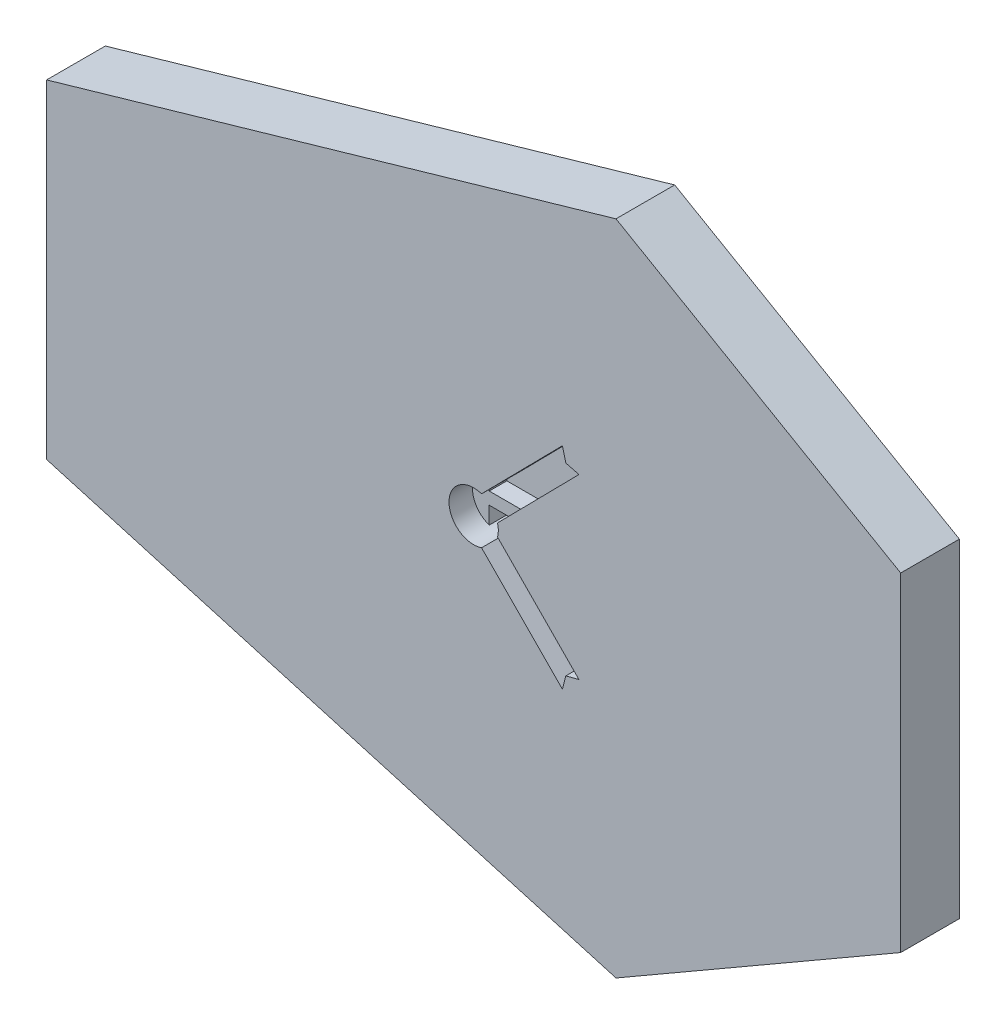
ISO-10303-21;
HEADER;
FILE_DESCRIPTION(('STEP AP214'),'2;1');
FILE_NAME('part.step','',(''),(''),'','','');
FILE_SCHEMA(('AUTOMOTIVE_DESIGN { 1 0 10303 214 1 1 1 1 }'));
ENDSEC;
DATA;
#1=APPLICATION_CONTEXT('core data for automotive mechanical design processes');
#2=APPLICATION_PROTOCOL_DEFINITION('international standard','automotive_design',2000,#1);
#3=PRODUCT_CONTEXT('',#1,'mechanical');
#4=PRODUCT('Part','Part','',(#3));
#5=PRODUCT_RELATED_PRODUCT_CATEGORY('part','',(#4));
#6=PRODUCT_DEFINITION_FORMATION('','',#4);
#7=PRODUCT_DEFINITION_CONTEXT('part definition',#1,'design');
#8=PRODUCT_DEFINITION('design','',#6,#7);
#9=PRODUCT_DEFINITION_SHAPE('','',#8);
#10=(LENGTH_UNIT() NAMED_UNIT(*) SI_UNIT(.MILLI.,.METRE.));
#11=(NAMED_UNIT(*) PLANE_ANGLE_UNIT() SI_UNIT($,.RADIAN.));
#12=(NAMED_UNIT(*) SI_UNIT($,.STERADIAN.) SOLID_ANGLE_UNIT());
#13=UNCERTAINTY_MEASURE_WITH_UNIT(LENGTH_MEASURE(1.E-05),#10,'distance_accuracy_value','');
#14=(GEOMETRIC_REPRESENTATION_CONTEXT(3) GLOBAL_UNCERTAINTY_ASSIGNED_CONTEXT((#13)) GLOBAL_UNIT_ASSIGNED_CONTEXT((#10,
#11,#12)) REPRESENTATION_CONTEXT('',''));
#15=CARTESIAN_POINT('',(0.,0.,0.));
#16=DIRECTION('',(0.,0.,1.));
#17=DIRECTION('',(1.,0.,0.));
#18=AXIS2_PLACEMENT_3D('',#15,#16,#17);
#19=CARTESIAN_POINT('',(0.,0.,1.5));
#20=DIRECTION('',(0.,0.,1.));
#21=DIRECTION('',(1.,0.,0.));
#22=AXIS2_PLACEMENT_3D('',#19,#20,#21);
#23=PLANE('',#22);
#24=DIRECTION('',(0.,1.,0.));
#25=VECTOR('',#24,1.);
#26=CARTESIAN_POINT('',(-5.82213852858381,0.522265884903505,1.5));
#27=LINE('',#26,#25);
#28=CARTESIAN_POINT('',(-5.82213852858381,0.522265884903505,1.5));
#29=VERTEX_POINT('',#28);
#30=CARTESIAN_POINT('',(-5.82213852858381,1.9895300446068,1.5));
#31=VERTEX_POINT('',#30);
#32=EDGE_CURVE('E48',#29,#31,#27,.T.);
#33=ORIENTED_EDGE('',*,*,#32,.F.);
#34=DIRECTION('',(-1.,0.,0.));
#35=VECTOR('',#34,1.);
#36=CARTESIAN_POINT('',(-3.11597975785287,0.522265884903505,1.5));
#37=LINE('',#36,#35);
#38=CARTESIAN_POINT('',(-3.11597975785287,0.522265884903505,1.5));
#39=VERTEX_POINT('',#38);
#40=EDGE_CURVE('E223',#39,#29,#37,.T.);
#41=ORIENTED_EDGE('',*,*,#40,.F.);
#42=DIRECTION('',(-0.701838567717168,-0.712336033670005,0.));
#43=VECTOR('',#42,1.);
#44=CARTESIAN_POINT('',(-3.11597975785287,0.522265884903505,1.5));
#45=LINE('',#44,#43);
#46=CARTESIAN_POINT('',(2.00904872497232,5.72394990431564,1.5));
#47=VERTEX_POINT('',#46);
#48=EDGE_CURVE('E303',#47,#39,#45,.T.);
#49=ORIENTED_EDGE('',*,*,#48,.F.);
#50=DIRECTION('',(0.712336033670005,-0.701838567717168,0.));
#51=VECTOR('',#50,1.);
#52=CARTESIAN_POINT('',(2.00904872497232,5.72394990431564,1.5));
#53=LINE('',#52,#51);
#54=CARTESIAN_POINT('',(0.584447895170022,7.12755685201684,1.5));
#55=VERTEX_POINT('',#54);
#56=EDGE_CURVE('E257',#55,#47,#53,.T.);
#57=ORIENTED_EDGE('',*,*,#56,.F.);
#58=DIRECTION('',(0.701838567717168,0.712336033670005,0.));
#59=VECTOR('',#58,1.);
#60=CARTESIAN_POINT('',(2.4087145761827,8.97910926261704,1.5));
#61=LINE('',#60,#59);
#62=CARTESIAN_POINT('',(-4.47786147141695,1.9895300446068,1.5));
#63=VERTEX_POINT('',#62);
#64=EDGE_CURVE('E306',#63,#55,#61,.T.);
#65=ORIENTED_EDGE('',*,*,#64,.F.);
#66=CARTESIAN_POINT('',(-5.15000000000038,-1.45716771982052E-13,1.5));
#67=DIRECTION('',(0.,0.,1.));
#68=DIRECTION('',(1.,0.,0.));
#69=AXIS2_PLACEMENT_3D('',#66,#67,#68);
#70=CIRCLE('',#69,2.1);
#71=EDGE_CURVE('E37',#31,#63,#70,.F.);
#72=ORIENTED_EDGE('',*,*,#71,.F.);
#73=EDGE_LOOP('',(#33,#41,#49,#57,#65,#72));
#74=FACE_BOUND('',#73,.T.);
#75=ADVANCED_FACE('F33',(#74),#23,.T.);
#76=DIRECTION('',(1.,0.,0.));
#77=VECTOR('',#76,1.);
#78=CARTESIAN_POINT('',(-3.11597975785287,-0.522265884903505,1.5));
#79=LINE('',#78,#77);
#80=CARTESIAN_POINT('',(-5.82213852858381,-0.522265884903505,1.5));
#81=VERTEX_POINT('',#80);
#82=CARTESIAN_POINT('',(-3.1159797578528,-0.522265884903505,1.5));
#83=VERTEX_POINT('',#82);
#84=EDGE_CURVE('E56',#81,#83,#79,.T.);
#85=ORIENTED_EDGE('',*,*,#84,.F.);
#86=DIRECTION('',(0.,1.,0.));
#87=VECTOR('',#86,1.);
#88=CARTESIAN_POINT('',(-5.82213852858381,-0.522265884903505,1.5));
#89=LINE('',#88,#87);
#90=CARTESIAN_POINT('',(-5.82213852858381,-1.98953004460709,1.5));
#91=VERTEX_POINT('',#90);
#92=EDGE_CURVE('E418',#91,#81,#89,.T.);
#93=ORIENTED_EDGE('',*,*,#92,.F.);
#94=CARTESIAN_POINT('',(-4.47786147141695,-1.9895300446068,1.5));
#95=VERTEX_POINT('',#94);
#96=EDGE_CURVE('E11',#95,#91,#70,.F.);
#97=ORIENTED_EDGE('',*,*,#96,.F.);
#98=DIRECTION('',(0.701838567717168,-0.712336033670005,0.));
#99=VECTOR('',#98,1.);
#100=CARTESIAN_POINT('',(2.4087145761827,-8.97910926261704,1.5));
#101=LINE('',#100,#99);
#102=CARTESIAN_POINT('',(0.584447895170023,-7.12755685201684,1.5));
#103=VERTEX_POINT('',#102);
#104=EDGE_CURVE('E251',#95,#103,#101,.T.);
#105=ORIENTED_EDGE('',*,*,#104,.T.);
#106=DIRECTION('',(0.712336033670005,0.701838567717168,0.));
#107=VECTOR('',#106,1.);
#108=CARTESIAN_POINT('',(2.00904872497232,-5.72394990431564,1.5));
#109=LINE('',#108,#107);
#110=CARTESIAN_POINT('',(2.00904872497232,-5.72394990431564,1.5));
#111=VERTEX_POINT('',#110);
#112=EDGE_CURVE('E224',#103,#111,#109,.T.);
#113=ORIENTED_EDGE('',*,*,#112,.T.);
#114=DIRECTION('',(-0.701838567717168,0.712336033670005,0.));
#115=VECTOR('',#114,1.);
#116=CARTESIAN_POINT('',(-3.11597975785287,-0.522265884903505,1.5));
#117=LINE('',#116,#115);
#118=EDGE_CURVE('E254',#111,#83,#117,.T.);
#119=ORIENTED_EDGE('',*,*,#118,.T.);
#120=EDGE_LOOP('',(#85,#93,#97,#105,#113,#119));
#121=FACE_BOUND('',#120,.T.);
#122=ADVANCED_FACE('F416',(#121),#23,.T.);
#123=CARTESIAN_POINT('',(-5.15000000000038,-1.45716771982052E-13,5.));
#124=DIRECTION('',(0.,0.,-1.));
#125=DIRECTION('',(-1.,0.,0.));
#126=AXIS2_PLACEMENT_3D('',#123,#124,#125);
#127=CYLINDRICAL_SURFACE('',#126,2.1);
#128=CARTESIAN_POINT('',(-5.15000000000038,-1.45716771982052E-13,3.));
#129=DIRECTION('',(0.,0.,1.));
#130=DIRECTION('',(1.,0.,0.));
#131=AXIS2_PLACEMENT_3D('',#128,#129,#130);
#132=CIRCLE('',#131,2.09999999999986);
#133=CARTESIAN_POINT('',(-5.82213852858381,1.9895300446068,3.));
#134=VERTEX_POINT('',#133);
#135=CARTESIAN_POINT('',(-5.8221385285839,-1.98953004460706,3.));
#136=VERTEX_POINT('',#135);
#137=EDGE_CURVE('E210',#134,#136,#132,.T.);
#138=ORIENTED_EDGE('',*,*,#137,.F.);
#139=DIRECTION('',(0.,0.,-1.));
#140=VECTOR('',#139,1.);
#141=CARTESIAN_POINT('',(-5.82213852858381,1.9895300446068,3.));
#142=LINE('',#141,#140);
#143=EDGE_CURVE('E207',#134,#31,#142,.T.);
#144=ORIENTED_EDGE('',*,*,#143,.T.);
#145=ORIENTED_EDGE('',*,*,#71,.T.);
#146=DIRECTION('',(0.,0.,1.));
#147=VECTOR('',#146,1.);
#148=CARTESIAN_POINT('',(-4.47786147141695,1.9895300446068,-11.3247854071458));
#149=LINE('',#148,#147);
#150=CARTESIAN_POINT('',(-4.47786147141695,1.9895300446068,5.));
#151=VERTEX_POINT('',#150);
#152=EDGE_CURVE('E307',#63,#151,#149,.T.);
#153=ORIENTED_EDGE('',*,*,#152,.T.);
#154=CARTESIAN_POINT('',(-5.15000000000038,-1.45716771982052E-13,5.));
#155=DIRECTION('',(0.,0.,1.));
#156=DIRECTION('',(1.,0.,0.));
#157=AXIS2_PLACEMENT_3D('',#154,#155,#156);
#158=CIRCLE('',#157,2.1);
#159=CARTESIAN_POINT('',(-4.47786147141695,-1.9895300446068,5.));
#160=VERTEX_POINT('',#159);
#161=EDGE_CURVE('E333',#151,#160,#158,.T.);
#162=ORIENTED_EDGE('',*,*,#161,.T.);
#163=DIRECTION('',(0.,0.,1.));
#164=VECTOR('',#163,1.);
#165=CARTESIAN_POINT('',(-4.47786147141695,-1.9895300446068,-11.3247854071458));
#166=LINE('',#165,#164);
#167=EDGE_CURVE('E269',#95,#160,#166,.T.);
#168=ORIENTED_EDGE('',*,*,#167,.F.);
#169=ORIENTED_EDGE('',*,*,#96,.T.);
#170=DIRECTION('',(0.,0.,-1.));
#171=VECTOR('',#170,1.);
#172=CARTESIAN_POINT('',(-5.82213852858385,-1.98953004460693,3.));
#173=LINE('',#172,#171);
#174=EDGE_CURVE('E229',#136,#91,#173,.T.);
#175=ORIENTED_EDGE('',*,*,#174,.F.);
#176=EDGE_LOOP('',(#138,#144,#145,#153,#162,#168,#169,#175));
#177=FACE_BOUND('',#176,.T.);
#178=ADVANCED_FACE('F386',(#177),#127,.F.);
#179=CARTESIAN_POINT('',(0.,0.,0.));
#180=DIRECTION('',(0.,0.,1.));
#181=DIRECTION('',(1.,0.,0.));
#182=AXIS2_PLACEMENT_3D('',#179,#180,#181);
#183=PLANE('',#182);
#184=DIRECTION('',(-0.960768922830523,-0.277350098112614,0.));
#185=VECTOR('',#184,1.);
#186=CARTESIAN_POINT('',(-41.5230669589465,14.,0.));
#187=LINE('',#186,#185);
#188=CARTESIAN_POINT('',(6.97435565298217,28.,0.));
#189=VERTEX_POINT('',#188);
#190=CARTESIAN_POINT('',(-41.5230669589465,14.,0.));
#191=VERTEX_POINT('',#190);
#192=EDGE_CURVE('E353',#189,#191,#187,.T.);
#193=ORIENTED_EDGE('',*,*,#192,.F.);
#194=DIRECTION('',(-0.866025403784439,0.5,0.));
#195=VECTOR('',#194,1.);
#196=CARTESIAN_POINT('',(31.2230669589464,14.,0.));
#197=LINE('',#196,#195);
#198=CARTESIAN_POINT('',(31.2230669589464,14.,0.));
#199=VERTEX_POINT('',#198);
#200=EDGE_CURVE('E364',#199,#189,#197,.T.);
#201=ORIENTED_EDGE('',*,*,#200,.F.);
#202=DIRECTION('',(0.,1.,0.));
#203=VECTOR('',#202,1.);
#204=CARTESIAN_POINT('',(31.2230669589464,-14.,0.));
#205=LINE('',#204,#203);
#206=CARTESIAN_POINT('',(31.2230669589464,-14.,0.));
#207=VERTEX_POINT('',#206);
#208=EDGE_CURVE('E362',#207,#199,#205,.T.);
#209=ORIENTED_EDGE('',*,*,#208,.F.);
#210=DIRECTION('',(0.866025403784439,0.5,0.));
#211=VECTOR('',#210,1.);
#212=CARTESIAN_POINT('',(6.97435565298217,-28.,0.));
#213=LINE('',#212,#211);
#214=CARTESIAN_POINT('',(6.97435565298217,-28.,0.));
#215=VERTEX_POINT('',#214);
#216=EDGE_CURVE('E360',#215,#207,#213,.T.);
#217=ORIENTED_EDGE('',*,*,#216,.F.);
#218=DIRECTION('',(0.960768922830523,-0.277350098112614,0.));
#219=VECTOR('',#218,1.);
#220=CARTESIAN_POINT('',(6.97435565298217,-28.,0.));
#221=LINE('',#220,#219);
#222=CARTESIAN_POINT('',(-41.5230669589465,-14.,0.));
#223=VERTEX_POINT('',#222);
#224=EDGE_CURVE('E358',#223,#215,#221,.T.);
#225=ORIENTED_EDGE('',*,*,#224,.F.);
#226=DIRECTION('',(0.,-1.,0.));
#227=VECTOR('',#226,1.);
#228=CARTESIAN_POINT('',(-41.5230669589465,14.,0.));
#229=LINE('',#228,#227);
#230=EDGE_CURVE('E356',#191,#223,#229,.T.);
#231=ORIENTED_EDGE('',*,*,#230,.F.);
#232=EDGE_LOOP('',(#193,#201,#209,#217,#225,#231));
#233=FACE_BOUND('',#232,.T.);
#234=DIRECTION('',(-0.250229959450548,0.968186432146917,0.));
#235=VECTOR('',#234,1.);
#236=CARTESIAN_POINT('',(2.4087145761827,8.97910926261704,0.));
#237=LINE('',#236,#235);
#238=CARTESIAN_POINT('',(2.7004254455055,7.85042544550625,0.));
#239=VERTEX_POINT('',#238);
#240=CARTESIAN_POINT('',(2.4087145761827,8.97910926261704,0.));
#241=VERTEX_POINT('',#240);
#242=EDGE_CURVE('E293',#239,#241,#237,.T.);
#243=ORIENTED_EDGE('',*,*,#242,.T.);
#244=DIRECTION('',(-0.701838567717168,-0.712336033670005,0.));
#245=VECTOR('',#244,1.);
#246=CARTESIAN_POINT('',(0.584447895170023,7.12755685201684,0.));
#247=LINE('',#246,#245);
#248=CARTESIAN_POINT('',(0.584447895170023,7.12755685201684,0.));
#249=VERTEX_POINT('',#248);
#250=EDGE_CURVE('E281',#241,#249,#247,.T.);
#251=ORIENTED_EDGE('',*,*,#250,.T.);
#252=DIRECTION('',(0.712336033670005,-0.701838567717168,0.));
#253=VECTOR('',#252,1.);
#254=CARTESIAN_POINT('',(2.00904872497232,5.72394990431564,0.));
#255=LINE('',#254,#253);
#256=CARTESIAN_POINT('',(2.00904872497232,5.72394990431564,0.));
#257=VERTEX_POINT('',#256);
#258=EDGE_CURVE('E284',#249,#257,#255,.T.);
#259=ORIENTED_EDGE('',*,*,#258,.T.);
#260=DIRECTION('',(0.701838567717168,0.712336033670005,0.));
#261=VECTOR('',#260,1.);
#262=CARTESIAN_POINT('',(3.81927842247489,7.56125537891345,0.));
#263=LINE('',#262,#261);
#264=CARTESIAN_POINT('',(3.81927842247489,7.56125537891345,0.));
#265=VERTEX_POINT('',#264);
#266=EDGE_CURVE('E287',#257,#265,#263,.T.);
#267=ORIENTED_EDGE('',*,*,#266,.T.);
#268=DIRECTION('',(-0.968186432146917,0.250229959450549,0.));
#269=VECTOR('',#268,1.);
#270=CARTESIAN_POINT('',(2.7004254455055,7.85042544550625,0.));
#271=LINE('',#270,#269);
#272=EDGE_CURVE('E290',#265,#239,#271,.T.);
#273=ORIENTED_EDGE('',*,*,#272,.T.);
#274=EDGE_LOOP('',(#243,#251,#259,#267,#273));
#275=FACE_BOUND('',#274,.T.);
#276=DIRECTION('',(-0.701838567717168,0.712336033670005,0.));
#277=VECTOR('',#276,1.);
#278=CARTESIAN_POINT('',(0.584447895170023,-7.12755685201684,0.));
#279=LINE('',#278,#277);
#280=CARTESIAN_POINT('',(2.4087145761827,-8.97910926261704,0.));
#281=VERTEX_POINT('',#280);
#282=CARTESIAN_POINT('',(0.584447895170023,-7.12755685201684,0.));
#283=VERTEX_POINT('',#282);
#284=EDGE_CURVE('E227',#281,#283,#279,.T.);
#285=ORIENTED_EDGE('',*,*,#284,.F.);
#286=DIRECTION('',(-0.250229959450548,-0.968186432146917,0.));
#287=VECTOR('',#286,1.);
#288=CARTESIAN_POINT('',(2.4087145761827,-8.97910926261704,0.));
#289=LINE('',#288,#287);
#290=CARTESIAN_POINT('',(2.7004254455055,-7.85042544550625,0.));
#291=VERTEX_POINT('',#290);
#292=EDGE_CURVE('E234',#291,#281,#289,.T.);
#293=ORIENTED_EDGE('',*,*,#292,.F.);
#294=DIRECTION('',(-0.968186432146917,-0.250229959450549,0.));
#295=VECTOR('',#294,1.);
#296=CARTESIAN_POINT('',(2.7004254455055,-7.85042544550625,0.));
#297=LINE('',#296,#295);
#298=CARTESIAN_POINT('',(3.81927842247489,-7.56125537891345,0.));
#299=VERTEX_POINT('',#298);
#300=EDGE_CURVE('E237',#299,#291,#297,.T.);
#301=ORIENTED_EDGE('',*,*,#300,.F.);
#302=DIRECTION('',(0.701838567717168,-0.712336033670005,0.));
#303=VECTOR('',#302,1.);
#304=CARTESIAN_POINT('',(3.81927842247489,-7.56125537891345,0.));
#305=LINE('',#304,#303);
#306=CARTESIAN_POINT('',(2.00904872497232,-5.72394990431564,0.));
#307=VERTEX_POINT('',#306);
#308=EDGE_CURVE('E240',#307,#299,#305,.T.);
#309=ORIENTED_EDGE('',*,*,#308,.F.);
#310=DIRECTION('',(0.712336033670005,0.701838567717168,0.));
#311=VECTOR('',#310,1.);
#312=CARTESIAN_POINT('',(2.00904872497232,-5.72394990431564,0.));
#313=LINE('',#312,#311);
#314=EDGE_CURVE('E243',#283,#307,#313,.T.);
#315=ORIENTED_EDGE('',*,*,#314,.F.);
#316=EDGE_LOOP('',(#285,#293,#301,#309,#315));
#317=FACE_BOUND('',#316,.T.);
#318=ADVANCED_FACE('F401',(#233,#275,#317),#183,.F.);
#319=CARTESIAN_POINT('',(0.,0.,5.));
#320=DIRECTION('',(0.,0.,1.));
#321=DIRECTION('',(1.,0.,0.));
#322=AXIS2_PLACEMENT_3D('',#319,#320,#321);
#323=PLANE('',#322);
#324=DIRECTION('',(-0.866025403784439,0.5,0.));
#325=VECTOR('',#324,1.);
#326=CARTESIAN_POINT('',(31.2230669589464,14.,5.));
#327=LINE('',#326,#325);
#328=CARTESIAN_POINT('',(31.2230669589464,14.,5.));
#329=VERTEX_POINT('',#328);
#330=CARTESIAN_POINT('',(6.97435565298217,28.,5.));
#331=VERTEX_POINT('',#330);
#332=EDGE_CURVE('E335',#329,#331,#327,.T.);
#333=ORIENTED_EDGE('',*,*,#332,.T.);
#334=DIRECTION('',(-0.960768922830523,-0.277350098112614,0.));
#335=VECTOR('',#334,1.);
#336=CARTESIAN_POINT('',(6.97435565298217,28.,5.));
#337=LINE('',#336,#335);
#338=CARTESIAN_POINT('',(-41.5230669589465,14.,5.));
#339=VERTEX_POINT('',#338);
#340=EDGE_CURVE('E338',#331,#339,#337,.T.);
#341=ORIENTED_EDGE('',*,*,#340,.T.);
#342=DIRECTION('',(0.,-1.,0.));
#343=VECTOR('',#342,1.);
#344=CARTESIAN_POINT('',(-41.5230669589465,14.,5.));
#345=LINE('',#344,#343);
#346=CARTESIAN_POINT('',(-41.5230669589465,-14.,5.));
#347=VERTEX_POINT('',#346);
#348=EDGE_CURVE('E341',#339,#347,#345,.T.);
#349=ORIENTED_EDGE('',*,*,#348,.T.);
#350=DIRECTION('',(0.960768922830523,-0.277350098112614,0.));
#351=VECTOR('',#350,1.);
#352=CARTESIAN_POINT('',(-41.5230669589465,-14.,5.));
#353=LINE('',#352,#351);
#354=CARTESIAN_POINT('',(6.97435565298217,-28.,5.));
#355=VERTEX_POINT('',#354);
#356=EDGE_CURVE('E344',#347,#355,#353,.T.);
#357=ORIENTED_EDGE('',*,*,#356,.T.);
#358=DIRECTION('',(0.866025403784439,0.5,0.));
#359=VECTOR('',#358,1.);
#360=CARTESIAN_POINT('',(6.97435565298217,-28.,5.));
#361=LINE('',#360,#359);
#362=CARTESIAN_POINT('',(31.2230669589464,-14.,5.));
#363=VERTEX_POINT('',#362);
#364=EDGE_CURVE('E347',#355,#363,#361,.T.);
#365=ORIENTED_EDGE('',*,*,#364,.T.);
#366=DIRECTION('',(0.,1.,0.));
#367=VECTOR('',#366,1.);
#368=CARTESIAN_POINT('',(31.2230669589464,-14.,5.));
#369=LINE('',#368,#367);
#370=EDGE_CURVE('E350',#363,#329,#369,.T.);
#371=ORIENTED_EDGE('',*,*,#370,.T.);
#372=EDGE_LOOP('',(#333,#341,#349,#357,#365,#371));
#373=FACE_BOUND('',#372,.T.);
#374=DIRECTION('',(-0.250229959450548,-0.968186432146917,0.));
#375=VECTOR('',#374,1.);
#376=CARTESIAN_POINT('',(2.7004254455055,-7.85042544550625,5.));
#377=LINE('',#376,#375);
#378=CARTESIAN_POINT('',(2.7004254455055,-7.85042544550625,5.));
#379=VERTEX_POINT('',#378);
#380=CARTESIAN_POINT('',(2.4087145761827,-8.97910926261704,5.));
#381=VERTEX_POINT('',#380);
#382=EDGE_CURVE('E260',#379,#381,#377,.T.);
#383=ORIENTED_EDGE('',*,*,#382,.T.);
#384=DIRECTION('',(-0.701838567717168,0.712336033670004,0.));
#385=VECTOR('',#384,1.);
#386=CARTESIAN_POINT('',(2.4087145761827,-8.97910926261704,5.));
#387=LINE('',#386,#385);
#388=EDGE_CURVE('E249',#381,#160,#387,.T.);
#389=ORIENTED_EDGE('',*,*,#388,.T.);
#390=ORIENTED_EDGE('',*,*,#161,.F.);
#391=DIRECTION('',(-0.701838567717168,-0.712336033670004,0.));
#392=VECTOR('',#391,1.);
#393=CARTESIAN_POINT('',(2.4087145761827,8.97910926261704,5.));
#394=LINE('',#393,#392);
#395=CARTESIAN_POINT('',(2.4087145761827,8.97910926261704,5.));
#396=VERTEX_POINT('',#395);
#397=EDGE_CURVE('E319',#396,#151,#394,.T.);
#398=ORIENTED_EDGE('',*,*,#397,.F.);
#399=DIRECTION('',(-0.250229959450548,0.968186432146917,0.));
#400=VECTOR('',#399,1.);
#401=CARTESIAN_POINT('',(2.7004254455055,7.85042544550625,5.));
#402=LINE('',#401,#400);
#403=CARTESIAN_POINT('',(2.7004254455055,7.85042544550625,5.));
#404=VERTEX_POINT('',#403);
#405=EDGE_CURVE('E316',#404,#396,#402,.T.);
#406=ORIENTED_EDGE('',*,*,#405,.F.);
#407=DIRECTION('',(-0.968186432146917,0.250229959450549,0.));
#408=VECTOR('',#407,1.);
#409=CARTESIAN_POINT('',(3.81927842247489,7.56125537891345,5.));
#410=LINE('',#409,#408);
#411=CARTESIAN_POINT('',(3.81927842247489,7.56125537891345,5.));
#412=VERTEX_POINT('',#411);
#413=EDGE_CURVE('E313',#412,#404,#410,.T.);
#414=ORIENTED_EDGE('',*,*,#413,.F.);
#415=DIRECTION('',(0.701838567717168,0.712336033670005,0.));
#416=VECTOR('',#415,1.);
#417=CARTESIAN_POINT('',(-3.11597975785287,0.522265884903505,5.));
#418=LINE('',#417,#416);
#419=CARTESIAN_POINT('',(-3.11597975785287,0.522265884903505,5.));
#420=VERTEX_POINT('',#419);
#421=EDGE_CURVE('E301',#420,#412,#418,.T.);
#422=ORIENTED_EDGE('',*,*,#421,.F.);
#423=CARTESIAN_POINT('',(-3.11597975785287,-0.522265884903505,5.));
#424=VERTEX_POINT('',#423);
#425=EDGE_CURVE('E310',#424,#420,#158,.T.);
#426=ORIENTED_EDGE('',*,*,#425,.F.);
#427=DIRECTION('',(0.701838567717168,-0.712336033670005,0.));
#428=VECTOR('',#427,1.);
#429=CARTESIAN_POINT('',(-3.11597975785287,-0.522265884903505,5.));
#430=LINE('',#429,#428);
#431=CARTESIAN_POINT('',(3.81927842247489,-7.56125537891345,5.));
#432=VERTEX_POINT('',#431);
#433=EDGE_CURVE('E266',#424,#432,#430,.T.);
#434=ORIENTED_EDGE('',*,*,#433,.T.);
#435=DIRECTION('',(-0.968186432146917,-0.250229959450549,0.));
#436=VECTOR('',#435,1.);
#437=CARTESIAN_POINT('',(3.81927842247489,-7.56125537891345,5.));
#438=LINE('',#437,#436);
#439=EDGE_CURVE('E263',#432,#379,#438,.T.);
#440=ORIENTED_EDGE('',*,*,#439,.T.);
#441=EDGE_LOOP('',(#383,#389,#390,#398,#406,#414,#422,#426,#434,#440));
#442=FACE_BOUND('',#441,.T.);
#443=ADVANCED_FACE('F409',(#373,#442),#323,.T.);
#444=CARTESIAN_POINT('',(-5.15000000000038,-1.45716771982052E-13,3.));
#445=DIRECTION('',(0.,0.,1.));
#446=DIRECTION('',(1.,0.,0.));
#447=AXIS2_PLACEMENT_3D('',#444,#445,#446);
#448=CIRCLE('',#447,2.09999999999996);
#449=CARTESIAN_POINT('',(-3.11597975785287,-0.522265884903505,3.));
#450=VERTEX_POINT('',#449);
#451=CARTESIAN_POINT('',(-3.11597975785287,0.522265884903505,3.));
#452=VERTEX_POINT('',#451);
#453=EDGE_CURVE('E218',#450,#452,#448,.T.);
#454=ORIENTED_EDGE('',*,*,#453,.F.);
#455=DIRECTION('',(0.,0.,1.));
#456=VECTOR('',#455,1.);
#457=CARTESIAN_POINT('',(-3.11597975785287,-0.522265884903505,-11.3247854071458));
#458=LINE('',#457,#456);
#459=EDGE_CURVE('E272',#450,#424,#458,.T.);
#460=ORIENTED_EDGE('',*,*,#459,.T.);
#461=ORIENTED_EDGE('',*,*,#425,.T.);
#462=DIRECTION('',(0.,0.,1.));
#463=VECTOR('',#462,1.);
#464=CARTESIAN_POINT('',(-3.11597975785287,0.522265884903505,-11.3247854071458));
#465=LINE('',#464,#463);
#466=EDGE_CURVE('E321',#452,#420,#465,.T.);
#467=ORIENTED_EDGE('',*,*,#466,.F.);
#468=EDGE_LOOP('',(#454,#460,#461,#467));
#469=FACE_BOUND('',#468,.T.);
#470=ADVANCED_FACE('F448',(#469),#127,.F.);
#471=CARTESIAN_POINT('',(-41.5230669589465,14.,1.5));
#472=DIRECTION('',(0.277350098112614,-0.960768922830523,0.));
#473=DIRECTION('',(0.960768922830523,0.277350098112614,0.));
#474=AXIS2_PLACEMENT_3D('',#471,#472,#473);
#475=PLANE('',#474);
#476=ORIENTED_EDGE('',*,*,#192,.T.);
#477=DIRECTION('',(0.,0.,-1.));
#478=VECTOR('',#477,1.);
#479=CARTESIAN_POINT('',(-41.5230669589465,14.,1.5));
#480=LINE('',#479,#478);
#481=EDGE_CURVE('E380',#339,#191,#480,.T.);
#482=ORIENTED_EDGE('',*,*,#481,.F.);
#483=ORIENTED_EDGE('',*,*,#340,.F.);
#484=DIRECTION('',(0.,0.,-1.));
#485=VECTOR('',#484,1.);
#486=CARTESIAN_POINT('',(6.97435565298217,28.,1.5));
#487=LINE('',#486,#485);
#488=EDGE_CURVE('E366',#331,#189,#487,.T.);
#489=ORIENTED_EDGE('',*,*,#488,.T.);
#490=EDGE_LOOP('',(#476,#482,#483,#489));
#491=FACE_BOUND('',#490,.T.);
#492=ADVANCED_FACE('F35',(#491),#475,.F.);
#493=CARTESIAN_POINT('',(-41.5230669589465,14.,1.5));
#494=DIRECTION('',(1.,0.,0.));
#495=DIRECTION('',(0.,0.,-1.));
#496=AXIS2_PLACEMENT_3D('',#493,#494,#495);
#497=PLANE('',#496);
#498=ORIENTED_EDGE('',*,*,#230,.T.);
#499=DIRECTION('',(0.,0.,-1.));
#500=VECTOR('',#499,1.);
#501=CARTESIAN_POINT('',(-41.5230669589465,-14.,1.5));
#502=LINE('',#501,#500);
#503=EDGE_CURVE('E378',#347,#223,#502,.T.);
#504=ORIENTED_EDGE('',*,*,#503,.F.);
#505=ORIENTED_EDGE('',*,*,#348,.F.);
#506=ORIENTED_EDGE('',*,*,#481,.T.);
#507=EDGE_LOOP('',(#498,#504,#505,#506));
#508=FACE_BOUND('',#507,.T.);
#509=ADVANCED_FACE('F605',(#508),#497,.F.);
#510=CARTESIAN_POINT('',(6.97435565298217,-28.,1.5));
#511=DIRECTION('',(0.277350098112614,0.960768922830523,0.));
#512=DIRECTION('',(-0.960768922830523,0.277350098112614,0.));
#513=AXIS2_PLACEMENT_3D('',#510,#511,#512);
#514=PLANE('',#513);
#515=ORIENTED_EDGE('',*,*,#224,.T.);
#516=DIRECTION('',(0.,0.,-1.));
#517=VECTOR('',#516,1.);
#518=CARTESIAN_POINT('',(6.97435565298217,-28.,1.5));
#519=LINE('',#518,#517);
#520=EDGE_CURVE('E375',#355,#215,#519,.T.);
#521=ORIENTED_EDGE('',*,*,#520,.F.);
#522=ORIENTED_EDGE('',*,*,#356,.F.);
#523=ORIENTED_EDGE('',*,*,#503,.T.);
#524=EDGE_LOOP('',(#515,#521,#522,#523));
#525=FACE_BOUND('',#524,.T.);
#526=ADVANCED_FACE('F597',(#525),#514,.F.);
#527=CARTESIAN_POINT('',(6.97435565298217,-28.,1.5));
#528=DIRECTION('',(-0.5,0.866025403784439,0.));
#529=DIRECTION('',(-0.866025403784439,-0.5,0.));
#530=AXIS2_PLACEMENT_3D('',#527,#528,#529);
#531=PLANE('',#530);
#532=ORIENTED_EDGE('',*,*,#216,.T.);
#533=DIRECTION('',(0.,0.,-1.));
#534=VECTOR('',#533,1.);
#535=CARTESIAN_POINT('',(31.2230669589464,-14.,1.5));
#536=LINE('',#535,#534);
#537=EDGE_CURVE('E372',#363,#207,#536,.T.);
#538=ORIENTED_EDGE('',*,*,#537,.F.);
#539=ORIENTED_EDGE('',*,*,#364,.F.);
#540=ORIENTED_EDGE('',*,*,#520,.T.);
#541=EDGE_LOOP('',(#532,#538,#539,#540));
#542=FACE_BOUND('',#541,.T.);
#543=ADVANCED_FACE('F589',(#542),#531,.F.);
#544=CARTESIAN_POINT('',(31.2230669589464,-14.,1.5));
#545=DIRECTION('',(-1.,0.,0.));
#546=DIRECTION('',(0.,0.,1.));
#547=AXIS2_PLACEMENT_3D('',#544,#545,#546);
#548=PLANE('',#547);
#549=ORIENTED_EDGE('',*,*,#208,.T.);
#550=DIRECTION('',(0.,0.,-1.));
#551=VECTOR('',#550,1.);
#552=CARTESIAN_POINT('',(31.2230669589464,14.,1.5));
#553=LINE('',#552,#551);
#554=EDGE_CURVE('E369',#329,#199,#553,.T.);
#555=ORIENTED_EDGE('',*,*,#554,.F.);
#556=ORIENTED_EDGE('',*,*,#370,.F.);
#557=ORIENTED_EDGE('',*,*,#537,.T.);
#558=EDGE_LOOP('',(#549,#555,#556,#557));
#559=FACE_BOUND('',#558,.T.);
#560=ADVANCED_FACE('F582',(#559),#548,.F.);
#561=CARTESIAN_POINT('',(31.2230669589464,14.,1.5));
#562=DIRECTION('',(-0.5,-0.866025403784439,0.));
#563=DIRECTION('',(0.866025403784439,-0.5,0.));
#564=AXIS2_PLACEMENT_3D('',#561,#562,#563);
#565=PLANE('',#564);
#566=ORIENTED_EDGE('',*,*,#200,.T.);
#567=ORIENTED_EDGE('',*,*,#488,.F.);
#568=ORIENTED_EDGE('',*,*,#332,.F.);
#569=ORIENTED_EDGE('',*,*,#554,.T.);
#570=EDGE_LOOP('',(#566,#567,#568,#569));
#571=FACE_BOUND('',#570,.T.);
#572=ADVANCED_FACE('F494',(#571),#565,.F.);
#573=CARTESIAN_POINT('',(2.4087145761827,8.97910926261704,-11.3247854071458));
#574=DIRECTION('',(-0.712336033670005,0.701838567717168,0.));
#575=DIRECTION('',(-0.701838567717168,-0.712336033670005,0.));
#576=AXIS2_PLACEMENT_3D('',#573,#574,#575);
#577=PLANE('',#576);
#578=ORIENTED_EDGE('',*,*,#64,.T.);
#579=DIRECTION('',(0.,0.,1.));
#580=VECTOR('',#579,1.);
#581=CARTESIAN_POINT('',(0.584447895170023,7.12755685201684,0.));
#582=LINE('',#581,#580);
#583=EDGE_CURVE('E296',#249,#55,#582,.T.);
#584=ORIENTED_EDGE('',*,*,#583,.F.);
#585=ORIENTED_EDGE('',*,*,#250,.F.);
#586=DIRECTION('',(0.,0.,1.));
#587=VECTOR('',#586,1.);
#588=CARTESIAN_POINT('',(2.4087145761827,8.97910926261704,-11.3247854071458));
#589=LINE('',#588,#587);
#590=EDGE_CURVE('E324',#241,#396,#589,.T.);
#591=ORIENTED_EDGE('',*,*,#590,.T.);
#592=ORIENTED_EDGE('',*,*,#397,.T.);
#593=ORIENTED_EDGE('',*,*,#152,.F.);
#594=EDGE_LOOP('',(#578,#584,#585,#591,#592,#593));
#595=FACE_BOUND('',#594,.T.);
#596=ADVANCED_FACE('F390',(#595),#577,.F.);
#597=CARTESIAN_POINT('',(2.7004254455055,7.85042544550625,-11.3247854071458));
#598=DIRECTION('',(0.968186432146917,0.250229959450548,0.));
#599=DIRECTION('',(-0.250229959450548,0.968186432146917,0.));
#600=AXIS2_PLACEMENT_3D('',#597,#598,#599);
#601=PLANE('',#600);
#602=ORIENTED_EDGE('',*,*,#590,.F.);
#603=ORIENTED_EDGE('',*,*,#242,.F.);
#604=DIRECTION('',(0.,0.,1.));
#605=VECTOR('',#604,1.);
#606=CARTESIAN_POINT('',(2.7004254455055,7.85042544550625,-11.3247854071458));
#607=LINE('',#606,#605);
#608=EDGE_CURVE('E326',#239,#404,#607,.T.);
#609=ORIENTED_EDGE('',*,*,#608,.T.);
#610=ORIENTED_EDGE('',*,*,#405,.T.);
#611=EDGE_LOOP('',(#602,#603,#609,#610));
#612=FACE_BOUND('',#611,.T.);
#613=ADVANCED_FACE('F405',(#612),#601,.F.);
#614=CARTESIAN_POINT('',(3.81927842247489,7.56125537891345,-11.3247854071458));
#615=DIRECTION('',(0.250229959450549,0.968186432146917,0.));
#616=DIRECTION('',(-0.968186432146917,0.250229959450549,0.));
#617=AXIS2_PLACEMENT_3D('',#614,#615,#616);
#618=PLANE('',#617);
#619=ORIENTED_EDGE('',*,*,#608,.F.);
#620=ORIENTED_EDGE('',*,*,#272,.F.);
#621=DIRECTION('',(0.,0.,1.));
#622=VECTOR('',#621,1.);
#623=CARTESIAN_POINT('',(3.81927842247489,7.56125537891345,-11.3247854071458));
#624=LINE('',#623,#622);
#625=EDGE_CURVE('E328',#265,#412,#624,.T.);
#626=ORIENTED_EDGE('',*,*,#625,.T.);
#627=ORIENTED_EDGE('',*,*,#413,.T.);
#628=EDGE_LOOP('',(#619,#620,#626,#627));
#629=FACE_BOUND('',#628,.T.);
#630=ADVANCED_FACE('F453',(#629),#618,.F.);
#631=CARTESIAN_POINT('',(-3.11597975785287,0.522265884903505,-11.3247854071458));
#632=DIRECTION('',(0.712336033670005,-0.701838567717168,0.));
#633=DIRECTION('',(0.701838567717168,0.712336033670005,0.));
#634=AXIS2_PLACEMENT_3D('',#631,#632,#633);
#635=PLANE('',#634);
#636=ORIENTED_EDGE('',*,*,#625,.F.);
#637=ORIENTED_EDGE('',*,*,#266,.F.);
#638=DIRECTION('',(0.,0.,1.));
#639=VECTOR('',#638,1.);
#640=CARTESIAN_POINT('',(2.00904872497232,5.72394990431564,0.));
#641=LINE('',#640,#639);
#642=EDGE_CURVE('E299',#257,#47,#641,.T.);
#643=ORIENTED_EDGE('',*,*,#642,.T.);
#644=ORIENTED_EDGE('',*,*,#48,.T.);
#645=EDGE_CURVE('E330',#39,#452,#465,.T.);
#646=ORIENTED_EDGE('',*,*,#645,.T.);
#647=ORIENTED_EDGE('',*,*,#466,.T.);
#648=ORIENTED_EDGE('',*,*,#421,.T.);
#649=EDGE_LOOP('',(#636,#637,#643,#644,#646,#647,#648));
#650=FACE_BOUND('',#649,.T.);
#651=ADVANCED_FACE('F451',(#650),#635,.F.);
#652=CARTESIAN_POINT('',(2.00904872497232,5.72394990431564,0.));
#653=DIRECTION('',(-0.701838567717168,-0.712336033670004,0.));
#654=DIRECTION('',(0.712336033670004,-0.701838567717168,0.));
#655=AXIS2_PLACEMENT_3D('',#652,#653,#654);
#656=PLANE('',#655);
#657=ORIENTED_EDGE('',*,*,#56,.T.);
#658=ORIENTED_EDGE('',*,*,#642,.F.);
#659=ORIENTED_EDGE('',*,*,#258,.F.);
#660=ORIENTED_EDGE('',*,*,#583,.T.);
#661=EDGE_LOOP('',(#657,#658,#659,#660));
#662=FACE_BOUND('',#661,.T.);
#663=ADVANCED_FACE('F396',(#662),#656,.F.);
#664=CARTESIAN_POINT('',(2.4087145761827,-8.97910926261704,-11.3247854071458));
#665=DIRECTION('',(0.712336033670005,0.701838567717168,0.));
#666=DIRECTION('',(-0.701838567717168,0.712336033670005,0.));
#667=AXIS2_PLACEMENT_3D('',#664,#665,#666);
#668=PLANE('',#667);
#669=ORIENTED_EDGE('',*,*,#167,.T.);
#670=ORIENTED_EDGE('',*,*,#388,.F.);
#671=DIRECTION('',(0.,0.,1.));
#672=VECTOR('',#671,1.);
#673=CARTESIAN_POINT('',(2.4087145761827,-8.97910926261704,-11.3247854071458));
#674=LINE('',#673,#672);
#675=EDGE_CURVE('E277',#281,#381,#674,.T.);
#676=ORIENTED_EDGE('',*,*,#675,.F.);
#677=ORIENTED_EDGE('',*,*,#284,.T.);
#678=DIRECTION('',(0.,0.,1.));
#679=VECTOR('',#678,1.);
#680=CARTESIAN_POINT('',(0.584447895170023,-7.12755685201684,0.));
#681=LINE('',#680,#679);
#682=EDGE_CURVE('E246',#283,#103,#681,.T.);
#683=ORIENTED_EDGE('',*,*,#682,.T.);
#684=ORIENTED_EDGE('',*,*,#104,.F.);
#685=EDGE_LOOP('',(#669,#670,#676,#677,#683,#684));
#686=FACE_BOUND('',#685,.T.);
#687=ADVANCED_FACE('F414',(#686),#668,.T.);
#688=CARTESIAN_POINT('',(2.7004254455055,-7.85042544550625,-11.3247854071458));
#689=DIRECTION('',(-0.968186432146917,0.250229959450548,0.));
#690=DIRECTION('',(-0.250229959450548,-0.968186432146917,0.));
#691=AXIS2_PLACEMENT_3D('',#688,#689,#690);
#692=PLANE('',#691);
#693=ORIENTED_EDGE('',*,*,#675,.T.);
#694=ORIENTED_EDGE('',*,*,#382,.F.);
#695=DIRECTION('',(0.,0.,1.));
#696=VECTOR('',#695,1.);
#697=CARTESIAN_POINT('',(2.7004254455055,-7.85042544550625,-11.3247854071458));
#698=LINE('',#697,#696);
#699=EDGE_CURVE('E275',#291,#379,#698,.T.);
#700=ORIENTED_EDGE('',*,*,#699,.F.);
#701=ORIENTED_EDGE('',*,*,#292,.T.);
#702=EDGE_LOOP('',(#693,#694,#700,#701));
#703=FACE_BOUND('',#702,.T.);
#704=ADVANCED_FACE('F461',(#703),#692,.T.);
#705=CARTESIAN_POINT('',(3.81927842247489,-7.56125537891345,-11.3247854071458));
#706=DIRECTION('',(-0.250229959450549,0.968186432146917,0.));
#707=DIRECTION('',(-0.968186432146917,-0.250229959450549,0.));
#708=AXIS2_PLACEMENT_3D('',#705,#706,#707);
#709=PLANE('',#708);
#710=ORIENTED_EDGE('',*,*,#699,.T.);
#711=ORIENTED_EDGE('',*,*,#439,.F.);
#712=DIRECTION('',(0.,0.,1.));
#713=VECTOR('',#712,1.);
#714=CARTESIAN_POINT('',(3.81927842247489,-7.56125537891345,-11.3247854071458));
#715=LINE('',#714,#713);
#716=EDGE_CURVE('E273',#299,#432,#715,.T.);
#717=ORIENTED_EDGE('',*,*,#716,.F.);
#718=ORIENTED_EDGE('',*,*,#300,.T.);
#719=EDGE_LOOP('',(#710,#711,#717,#718));
#720=FACE_BOUND('',#719,.T.);
#721=ADVANCED_FACE('F457',(#720),#709,.T.);
#722=CARTESIAN_POINT('',(-3.11597975785287,-0.522265884903505,-11.3247854071458));
#723=DIRECTION('',(-0.712336033670005,-0.701838567717168,0.));
#724=DIRECTION('',(0.701838567717168,-0.712336033670005,0.));
#725=AXIS2_PLACEMENT_3D('',#722,#723,#724);
#726=PLANE('',#725);
#727=ORIENTED_EDGE('',*,*,#716,.T.);
#728=ORIENTED_EDGE('',*,*,#433,.F.);
#729=ORIENTED_EDGE('',*,*,#459,.F.);
#730=EDGE_CURVE('E255',#83,#450,#458,.T.);
#731=ORIENTED_EDGE('',*,*,#730,.F.);
#732=ORIENTED_EDGE('',*,*,#118,.F.);
#733=DIRECTION('',(0.,0.,1.));
#734=VECTOR('',#733,1.);
#735=CARTESIAN_POINT('',(2.00904872497232,-5.72394990431564,0.));
#736=LINE('',#735,#734);
#737=EDGE_CURVE('E244',#307,#111,#736,.T.);
#738=ORIENTED_EDGE('',*,*,#737,.F.);
#739=ORIENTED_EDGE('',*,*,#308,.T.);
#740=EDGE_LOOP('',(#727,#728,#729,#731,#732,#738,#739));
#741=FACE_BOUND('',#740,.T.);
#742=ADVANCED_FACE('F442',(#741),#726,.T.);
#743=CARTESIAN_POINT('',(2.00904872497232,-5.72394990431564,0.));
#744=DIRECTION('',(0.701838567717168,-0.712336033670004,0.));
#745=DIRECTION('',(0.712336033670004,0.701838567717168,0.));
#746=AXIS2_PLACEMENT_3D('',#743,#744,#745);
#747=PLANE('',#746);
#748=ORIENTED_EDGE('',*,*,#112,.F.);
#749=ORIENTED_EDGE('',*,*,#682,.F.);
#750=ORIENTED_EDGE('',*,*,#314,.T.);
#751=ORIENTED_EDGE('',*,*,#737,.T.);
#752=EDGE_LOOP('',(#748,#749,#750,#751));
#753=FACE_BOUND('',#752,.T.);
#754=ADVANCED_FACE('F465',(#753),#747,.T.);
#755=CARTESIAN_POINT('',(-3.11597975785287,0.522265884903505,3.));
#756=DIRECTION('',(0.,-1.,0.));
#757=DIRECTION('',(1.,0.,0.));
#758=AXIS2_PLACEMENT_3D('',#755,#756,#757);
#759=PLANE('',#758);
#760=ORIENTED_EDGE('',*,*,#40,.T.);
#761=DIRECTION('',(0.,0.,-1.));
#762=VECTOR('',#761,1.);
#763=CARTESIAN_POINT('',(-5.82213852858381,0.522265884903505,3.));
#764=LINE('',#763,#762);
#765=CARTESIAN_POINT('',(-5.82213852858381,0.522265884903505,3.));
#766=VERTEX_POINT('',#765);
#767=EDGE_CURVE('E205',#766,#29,#764,.T.);
#768=ORIENTED_EDGE('',*,*,#767,.F.);
#769=DIRECTION('',(-1.,0.,0.));
#770=VECTOR('',#769,1.);
#771=CARTESIAN_POINT('',(-3.11597975785287,0.522265884903505,3.));
#772=LINE('',#771,#770);
#773=EDGE_CURVE('E211',#452,#766,#772,.T.);
#774=ORIENTED_EDGE('',*,*,#773,.F.);
#775=ORIENTED_EDGE('',*,*,#645,.F.);
#776=EDGE_LOOP('',(#760,#768,#774,#775));
#777=FACE_BOUND('',#776,.T.);
#778=ADVANCED_FACE('F222',(#777),#759,.F.);
#779=CARTESIAN_POINT('',(-5.82213852858381,0.522265884903505,3.));
#780=DIRECTION('',(-1.,0.,0.));
#781=DIRECTION('',(0.,0.,1.));
#782=AXIS2_PLACEMENT_3D('',#779,#780,#781);
#783=PLANE('',#782);
#784=ORIENTED_EDGE('',*,*,#32,.T.);
#785=ORIENTED_EDGE('',*,*,#143,.F.);
#786=DIRECTION('',(0.,1.,0.));
#787=VECTOR('',#786,1.);
#788=CARTESIAN_POINT('',(-5.82213852858381,0.522265884903505,3.));
#789=LINE('',#788,#787);
#790=EDGE_CURVE('E201',#766,#134,#789,.T.);
#791=ORIENTED_EDGE('',*,*,#790,.F.);
#792=ORIENTED_EDGE('',*,*,#767,.T.);
#793=EDGE_LOOP('',(#784,#785,#791,#792));
#794=FACE_BOUND('',#793,.T.);
#795=ADVANCED_FACE('F203',(#794),#783,.F.);
#796=CARTESIAN_POINT('',(-5.82213852858381,-0.522265884903505,3.));
#797=DIRECTION('',(-1.,0.,0.));
#798=DIRECTION('',(0.,0.,1.));
#799=AXIS2_PLACEMENT_3D('',#796,#797,#798);
#800=PLANE('',#799);
#801=ORIENTED_EDGE('',*,*,#92,.T.);
#802=DIRECTION('',(0.,0.,-1.));
#803=VECTOR('',#802,1.);
#804=CARTESIAN_POINT('',(-5.82213852858381,-0.522265884903505,3.));
#805=LINE('',#804,#803);
#806=CARTESIAN_POINT('',(-5.82213852858381,-0.522265884903505,3.));
#807=VERTEX_POINT('',#806);
#808=EDGE_CURVE('E426',#807,#81,#805,.T.);
#809=ORIENTED_EDGE('',*,*,#808,.F.);
#810=DIRECTION('',(0.,1.,0.));
#811=VECTOR('',#810,1.);
#812=CARTESIAN_POINT('',(-5.82213852858381,-0.522265884903505,3.));
#813=LINE('',#812,#811);
#814=EDGE_CURVE('E425',#136,#807,#813,.T.);
#815=ORIENTED_EDGE('',*,*,#814,.F.);
#816=ORIENTED_EDGE('',*,*,#174,.T.);
#817=EDGE_LOOP('',(#801,#809,#815,#816));
#818=FACE_BOUND('',#817,.T.);
#819=ADVANCED_FACE('F422',(#818),#800,.F.);
#820=CARTESIAN_POINT('',(-3.11597975785287,-0.522265884903505,3.));
#821=DIRECTION('',(0.,1.,0.));
#822=DIRECTION('',(-1.,0.,0.));
#823=AXIS2_PLACEMENT_3D('',#820,#821,#822);
#824=PLANE('',#823);
#825=ORIENTED_EDGE('',*,*,#84,.T.);
#826=ORIENTED_EDGE('',*,*,#730,.T.);
#827=DIRECTION('',(1.,0.,0.));
#828=VECTOR('',#827,1.);
#829=CARTESIAN_POINT('',(-3.11597975785287,-0.522265884903505,3.));
#830=LINE('',#829,#828);
#831=EDGE_CURVE('E434',#807,#450,#830,.T.);
#832=ORIENTED_EDGE('',*,*,#831,.F.);
#833=ORIENTED_EDGE('',*,*,#808,.T.);
#834=EDGE_LOOP('',(#825,#826,#832,#833));
#835=FACE_BOUND('',#834,.T.);
#836=ADVANCED_FACE('F439',(#835),#824,.F.);
#837=CARTESIAN_POINT('',(-5.15000000000038,-1.45716771982052E-13,3.));
#838=DIRECTION('',(0.,0.,1.));
#839=DIRECTION('',(1.,0.,0.));
#840=AXIS2_PLACEMENT_3D('',#837,#838,#839);
#841=PLANE('',#840);
#842=ORIENTED_EDGE('',*,*,#773,.T.);
#843=ORIENTED_EDGE('',*,*,#790,.T.);
#844=ORIENTED_EDGE('',*,*,#137,.T.);
#845=ORIENTED_EDGE('',*,*,#814,.T.);
#846=ORIENTED_EDGE('',*,*,#831,.T.);
#847=ORIENTED_EDGE('',*,*,#453,.T.);
#848=EDGE_LOOP('',(#842,#843,#844,#845,#846,#847));
#849=FACE_BOUND('',#848,.T.);
#850=ADVANCED_FACE('F215',(#849),#841,.T.);
#851=CLOSED_SHELL('',(#75,#122,#178,#318,#443,#470,#492,#509,#526,#543,#560,#572,#596,#613,#630,
#651,#663,#687,#704,#721,#742,#754,#778,#795,#819,#836,#850));
#852=MANIFOLD_SOLID_BREP('B2',#851);
#853=ADVANCED_BREP_SHAPE_REPRESENTATION('',(#18,#852),#14);
#854=SHAPE_DEFINITION_REPRESENTATION(#9,#853);
ENDSEC;
END-ISO-10303-21;
